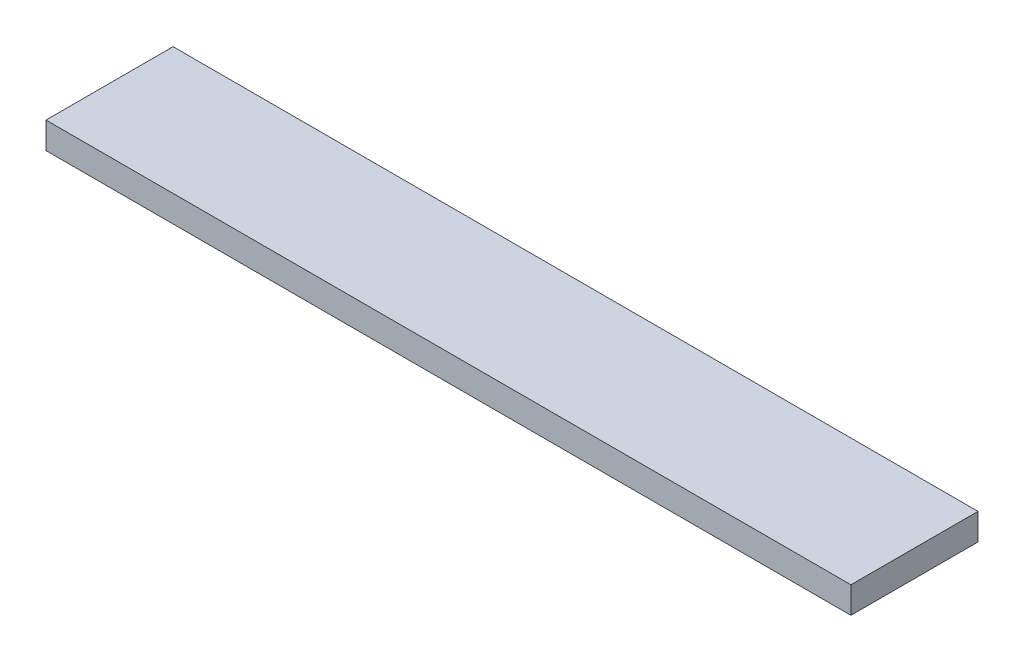
ISO-10303-21;
HEADER;
FILE_DESCRIPTION(('STEP AP214'),'2;1');
FILE_NAME('part.step','',(''),(''),'','','');
FILE_SCHEMA(('AUTOMOTIVE_DESIGN { 1 0 10303 214 1 1 1 1 }'));
ENDSEC;
DATA;
#1=APPLICATION_CONTEXT('core data for automotive mechanical design processes');
#2=APPLICATION_PROTOCOL_DEFINITION('international standard','automotive_design',2000,#1);
#3=PRODUCT_CONTEXT('',#1,'mechanical');
#4=PRODUCT('Part','Part','',(#3));
#5=PRODUCT_RELATED_PRODUCT_CATEGORY('part','',(#4));
#6=PRODUCT_DEFINITION_FORMATION('','',#4);
#7=PRODUCT_DEFINITION_CONTEXT('part definition',#1,'design');
#8=PRODUCT_DEFINITION('design','',#6,#7);
#9=PRODUCT_DEFINITION_SHAPE('','',#8);
#10=(LENGTH_UNIT() NAMED_UNIT(*) SI_UNIT(.MILLI.,.METRE.));
#11=(NAMED_UNIT(*) PLANE_ANGLE_UNIT() SI_UNIT($,.RADIAN.));
#12=(NAMED_UNIT(*) SI_UNIT($,.STERADIAN.) SOLID_ANGLE_UNIT());
#13=UNCERTAINTY_MEASURE_WITH_UNIT(LENGTH_MEASURE(1.E-05),#10,'distance_accuracy_value','');
#14=(GEOMETRIC_REPRESENTATION_CONTEXT(3) GLOBAL_UNCERTAINTY_ASSIGNED_CONTEXT((#13)) GLOBAL_UNIT_ASSIGNED_CONTEXT((#10,
#11,#12)) REPRESENTATION_CONTEXT('',''));
#15=CARTESIAN_POINT('',(0.,0.,0.));
#16=DIRECTION('',(0.,0.,1.));
#17=DIRECTION('',(1.,0.,0.));
#18=AXIS2_PLACEMENT_3D('',#15,#16,#17);
#19=CARTESIAN_POINT('',(380.,25.,-60.));
#20=DIRECTION('',(-1.,0.,0.));
#21=DIRECTION('',(0.,0.,1.));
#22=AXIS2_PLACEMENT_3D('',#19,#20,#21);
#23=PLANE('',#22);
#24=DIRECTION('',(0.,0.,-1.));
#25=VECTOR('',#24,1.);
#26=CARTESIAN_POINT('',(380.,0.,-60.));
#27=LINE('',#26,#25);
#28=CARTESIAN_POINT('',(380.,0.,60.));
#29=VERTEX_POINT('',#28);
#30=CARTESIAN_POINT('',(380.,0.,-60.));
#31=VERTEX_POINT('',#30);
#32=EDGE_CURVE('E107',#29,#31,#27,.T.);
#33=ORIENTED_EDGE('',*,*,#32,.T.);
#34=DIRECTION('',(0.,-1.,0.));
#35=VECTOR('',#34,1.);
#36=CARTESIAN_POINT('',(380.,25.,-60.));
#37=LINE('',#36,#35);
#38=CARTESIAN_POINT('',(380.,25.,-60.));
#39=VERTEX_POINT('',#38);
#40=EDGE_CURVE('E11',#39,#31,#37,.T.);
#41=ORIENTED_EDGE('',*,*,#40,.F.);
#42=DIRECTION('',(0.,0.,-1.));
#43=VECTOR('',#42,1.);
#44=CARTESIAN_POINT('',(380.,25.,-60.));
#45=LINE('',#44,#43);
#46=CARTESIAN_POINT('',(380.,25.,60.));
#47=VERTEX_POINT('',#46);
#48=EDGE_CURVE('E91',#47,#39,#45,.T.);
#49=ORIENTED_EDGE('',*,*,#48,.F.);
#50=DIRECTION('',(0.,-1.,0.));
#51=VECTOR('',#50,1.);
#52=CARTESIAN_POINT('',(380.,25.,60.));
#53=LINE('',#52,#51);
#54=EDGE_CURVE('E103',#47,#29,#53,.T.);
#55=ORIENTED_EDGE('',*,*,#54,.T.);
#56=EDGE_LOOP('',(#33,#41,#49,#55));
#57=FACE_BOUND('',#56,.T.);
#58=ADVANCED_FACE('F39',(#57),#23,.F.);
#59=CARTESIAN_POINT('',(-380.,25.,-60.));
#60=DIRECTION('',(0.,0.,1.));
#61=DIRECTION('',(1.,0.,0.));
#62=AXIS2_PLACEMENT_3D('',#59,#60,#61);
#63=PLANE('',#62);
#64=DIRECTION('',(-1.,0.,0.));
#65=VECTOR('',#64,1.);
#66=CARTESIAN_POINT('',(-380.,0.,-60.));
#67=LINE('',#66,#65);
#68=CARTESIAN_POINT('',(-380.,0.,-60.));
#69=VERTEX_POINT('',#68);
#70=EDGE_CURVE('E96',#31,#69,#67,.T.);
#71=ORIENTED_EDGE('',*,*,#70,.T.);
#72=DIRECTION('',(0.,-1.,0.));
#73=VECTOR('',#72,1.);
#74=CARTESIAN_POINT('',(-380.,25.,-60.));
#75=LINE('',#74,#73);
#76=CARTESIAN_POINT('',(-380.,25.,-60.));
#77=VERTEX_POINT('',#76);
#78=EDGE_CURVE('E48',#77,#69,#75,.T.);
#79=ORIENTED_EDGE('',*,*,#78,.F.);
#80=DIRECTION('',(-1.,0.,0.));
#81=VECTOR('',#80,1.);
#82=CARTESIAN_POINT('',(-380.,25.,-60.));
#83=LINE('',#82,#81);
#84=EDGE_CURVE('E86',#39,#77,#83,.T.);
#85=ORIENTED_EDGE('',*,*,#84,.F.);
#86=ORIENTED_EDGE('',*,*,#40,.T.);
#87=EDGE_LOOP('',(#71,#79,#85,#86));
#88=FACE_BOUND('',#87,.T.);
#89=ADVANCED_FACE('F95',(#88),#63,.F.);
#90=CARTESIAN_POINT('',(-380.,25.,-60.));
#91=DIRECTION('',(1.,0.,0.));
#92=DIRECTION('',(0.,0.,-1.));
#93=AXIS2_PLACEMENT_3D('',#90,#91,#92);
#94=PLANE('',#93);
#95=DIRECTION('',(0.,0.,1.));
#96=VECTOR('',#95,1.);
#97=CARTESIAN_POINT('',(-380.,0.,-60.));
#98=LINE('',#97,#96);
#99=CARTESIAN_POINT('',(-380.,0.,60.));
#100=VERTEX_POINT('',#99);
#101=EDGE_CURVE('E73',#69,#100,#98,.T.);
#102=ORIENTED_EDGE('',*,*,#101,.T.);
#103=DIRECTION('',(0.,-1.,0.));
#104=VECTOR('',#103,1.);
#105=CARTESIAN_POINT('',(-380.,25.,60.));
#106=LINE('',#105,#104);
#107=CARTESIAN_POINT('',(-380.,25.,60.));
#108=VERTEX_POINT('',#107);
#109=EDGE_CURVE('E98',#108,#100,#106,.T.);
#110=ORIENTED_EDGE('',*,*,#109,.F.);
#111=DIRECTION('',(0.,0.,1.));
#112=VECTOR('',#111,1.);
#113=CARTESIAN_POINT('',(-380.,25.,-60.));
#114=LINE('',#113,#112);
#115=EDGE_CURVE('E89',#77,#108,#114,.T.);
#116=ORIENTED_EDGE('',*,*,#115,.F.);
#117=ORIENTED_EDGE('',*,*,#78,.T.);
#118=EDGE_LOOP('',(#102,#110,#116,#117));
#119=FACE_BOUND('',#118,.T.);
#120=ADVANCED_FACE('F99',(#119),#94,.F.);
#121=CARTESIAN_POINT('',(-380.,25.,60.));
#122=DIRECTION('',(0.,0.,-1.));
#123=DIRECTION('',(-1.,0.,0.));
#124=AXIS2_PLACEMENT_3D('',#121,#122,#123);
#125=PLANE('',#124);
#126=DIRECTION('',(1.,0.,0.));
#127=VECTOR('',#126,1.);
#128=CARTESIAN_POINT('',(-380.,0.,60.));
#129=LINE('',#128,#127);
#130=EDGE_CURVE('E79',#100,#29,#129,.T.);
#131=ORIENTED_EDGE('',*,*,#130,.T.);
#132=ORIENTED_EDGE('',*,*,#54,.F.);
#133=DIRECTION('',(1.,0.,0.));
#134=VECTOR('',#133,1.);
#135=CARTESIAN_POINT('',(-380.,25.,60.));
#136=LINE('',#135,#134);
#137=EDGE_CURVE('E56',#108,#47,#136,.T.);
#138=ORIENTED_EDGE('',*,*,#137,.F.);
#139=ORIENTED_EDGE('',*,*,#109,.T.);
#140=EDGE_LOOP('',(#131,#132,#138,#139));
#141=FACE_BOUND('',#140,.T.);
#142=ADVANCED_FACE('F120',(#141),#125,.F.);
#143=CARTESIAN_POINT('',(0.,25.,0.));
#144=DIRECTION('',(0.,1.,0.));
#145=DIRECTION('',(0.,0.,1.));
#146=AXIS2_PLACEMENT_3D('',#143,#144,#145);
#147=PLANE('',#146);
#148=ORIENTED_EDGE('',*,*,#48,.T.);
#149=ORIENTED_EDGE('',*,*,#84,.T.);
#150=ORIENTED_EDGE('',*,*,#115,.T.);
#151=ORIENTED_EDGE('',*,*,#137,.T.);
#152=EDGE_LOOP('',(#148,#149,#150,#151));
#153=FACE_BOUND('',#152,.T.);
#154=ADVANCED_FACE('F87',(#153),#147,.T.);
#155=CARTESIAN_POINT('',(0.,0.,0.));
#156=DIRECTION('',(0.,1.,0.));
#157=DIRECTION('',(0.,0.,1.));
#158=AXIS2_PLACEMENT_3D('',#155,#156,#157);
#159=PLANE('',#158);
#160=ORIENTED_EDGE('',*,*,#32,.F.);
#161=ORIENTED_EDGE('',*,*,#130,.F.);
#162=ORIENTED_EDGE('',*,*,#101,.F.);
#163=ORIENTED_EDGE('',*,*,#70,.F.);
#164=EDGE_LOOP('',(#160,#161,#162,#163));
#165=FACE_BOUND('',#164,.T.);
#166=ADVANCED_FACE('F123',(#165),#159,.F.);
#167=CLOSED_SHELL('',(#58,#89,#120,#142,#154,#166));
#168=MANIFOLD_SOLID_BREP('B2',#167);
#169=ADVANCED_BREP_SHAPE_REPRESENTATION('',(#18,#168),#14);
#170=SHAPE_DEFINITION_REPRESENTATION(#9,#169);
ENDSEC;
END-ISO-10303-21;
